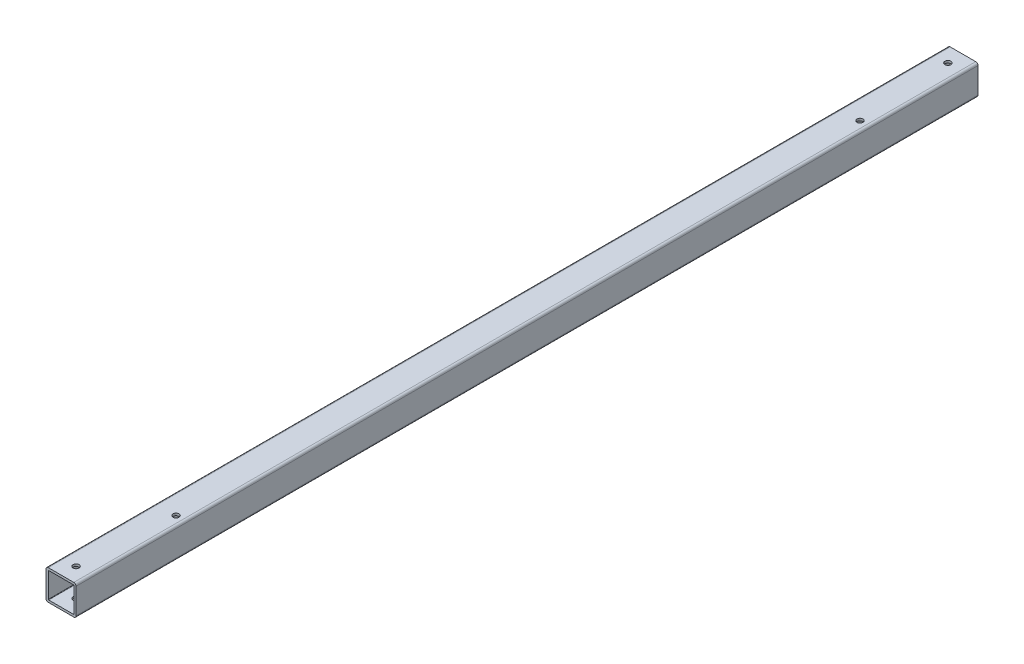
ISO-10303-21;
HEADER;
FILE_DESCRIPTION(('STEP AP214'),'2;1');
FILE_NAME('part.step','',(''),(''),'','','');
FILE_SCHEMA(('AUTOMOTIVE_DESIGN { 1 0 10303 214 1 1 1 1 }'));
ENDSEC;
DATA;
#1=APPLICATION_CONTEXT('core data for automotive mechanical design processes');
#2=APPLICATION_PROTOCOL_DEFINITION('international standard','automotive_design',2000,#1);
#3=PRODUCT_CONTEXT('',#1,'mechanical');
#4=PRODUCT('Part','Part','',(#3));
#5=PRODUCT_RELATED_PRODUCT_CATEGORY('part','',(#4));
#6=PRODUCT_DEFINITION_FORMATION('','',#4);
#7=PRODUCT_DEFINITION_CONTEXT('part definition',#1,'design');
#8=PRODUCT_DEFINITION('design','',#6,#7);
#9=PRODUCT_DEFINITION_SHAPE('','',#8);
#10=(LENGTH_UNIT() NAMED_UNIT(*) SI_UNIT(.MILLI.,.METRE.));
#11=(NAMED_UNIT(*) PLANE_ANGLE_UNIT() SI_UNIT($,.RADIAN.));
#12=(NAMED_UNIT(*) SI_UNIT($,.STERADIAN.) SOLID_ANGLE_UNIT());
#13=UNCERTAINTY_MEASURE_WITH_UNIT(LENGTH_MEASURE(1.E-05),#10,'distance_accuracy_value','');
#14=(GEOMETRIC_REPRESENTATION_CONTEXT(3) GLOBAL_UNCERTAINTY_ASSIGNED_CONTEXT((#13)) GLOBAL_UNIT_ASSIGNED_CONTEXT((#10,
#11,#12)) REPRESENTATION_CONTEXT('',''));
#15=CARTESIAN_POINT('',(0.,0.,0.));
#16=DIRECTION('',(0.,0.,1.));
#17=DIRECTION('',(1.,0.,0.));
#18=AXIS2_PLACEMENT_3D('',#15,#16,#17);
#19=CARTESIAN_POINT('',(0.,0.,1200.));
#20=DIRECTION('',(0.,0.,1.));
#21=DIRECTION('',(1.,0.,0.));
#22=AXIS2_PLACEMENT_3D('',#19,#20,#21);
#23=PLANE('',#22);
#24=DIRECTION('',(1.,0.,0.));
#25=VECTOR('',#24,1.);
#26=CARTESIAN_POINT('',(-20.,-20.,1200.));
#27=LINE('',#26,#25);
#28=CARTESIAN_POINT('',(-17.,-20.,1200.));
#29=VERTEX_POINT('',#28);
#30=CARTESIAN_POINT('',(17.,-20.,1200.));
#31=VERTEX_POINT('',#30);
#32=EDGE_CURVE('E199',#29,#31,#27,.T.);
#33=ORIENTED_EDGE('',*,*,#32,.T.);
#34=CARTESIAN_POINT('',(17.,-17.,1200.));
#35=DIRECTION('',(0.,0.,1.));
#36=DIRECTION('',(1.,0.,0.));
#37=AXIS2_PLACEMENT_3D('',#34,#35,#36);
#38=CIRCLE('',#37,3.);
#39=CARTESIAN_POINT('',(20.,-17.,1200.));
#40=VERTEX_POINT('',#39);
#41=EDGE_CURVE('E258',#31,#40,#38,.T.);
#42=ORIENTED_EDGE('',*,*,#41,.T.);
#43=DIRECTION('',(0.,1.,0.));
#44=VECTOR('',#43,1.);
#45=CARTESIAN_POINT('',(20.,20.,1200.));
#46=LINE('',#45,#44);
#47=CARTESIAN_POINT('',(20.,17.,1200.));
#48=VERTEX_POINT('',#47);
#49=EDGE_CURVE('E323',#40,#48,#46,.T.);
#50=ORIENTED_EDGE('',*,*,#49,.T.);
#51=CARTESIAN_POINT('',(17.,17.,1200.));
#52=DIRECTION('',(0.,0.,1.));
#53=DIRECTION('',(1.,0.,0.));
#54=AXIS2_PLACEMENT_3D('',#51,#52,#53);
#55=CIRCLE('',#54,3.);
#56=CARTESIAN_POINT('',(17.,20.,1200.));
#57=VERTEX_POINT('',#56);
#58=EDGE_CURVE('E254',#48,#57,#55,.T.);
#59=ORIENTED_EDGE('',*,*,#58,.T.);
#60=DIRECTION('',(-1.,0.,0.));
#61=VECTOR('',#60,1.);
#62=CARTESIAN_POINT('',(-20.,20.,1200.));
#63=LINE('',#62,#61);
#64=CARTESIAN_POINT('',(-17.,20.,1200.));
#65=VERTEX_POINT('',#64);
#66=EDGE_CURVE('E326',#57,#65,#63,.T.);
#67=ORIENTED_EDGE('',*,*,#66,.T.);
#68=CARTESIAN_POINT('',(-17.,17.,1200.));
#69=DIRECTION('',(0.,0.,1.));
#70=DIRECTION('',(1.,0.,0.));
#71=AXIS2_PLACEMENT_3D('',#68,#69,#70);
#72=CIRCLE('',#71,3.);
#73=CARTESIAN_POINT('',(-20.,17.,1200.));
#74=VERTEX_POINT('',#73);
#75=EDGE_CURVE('E80',#65,#74,#72,.T.);
#76=ORIENTED_EDGE('',*,*,#75,.T.);
#77=DIRECTION('',(0.,-1.,0.));
#78=VECTOR('',#77,1.);
#79=CARTESIAN_POINT('',(-20.,20.,1200.));
#80=LINE('',#79,#78);
#81=CARTESIAN_POINT('',(-20.,-17.,1200.));
#82=VERTEX_POINT('',#81);
#83=EDGE_CURVE('E204',#74,#82,#80,.T.);
#84=ORIENTED_EDGE('',*,*,#83,.T.);
#85=CARTESIAN_POINT('',(-17.,-17.,1200.));
#86=DIRECTION('',(0.,0.,1.));
#87=DIRECTION('',(1.,0.,0.));
#88=AXIS2_PLACEMENT_3D('',#85,#86,#87);
#89=CIRCLE('',#88,3.);
#90=EDGE_CURVE('E256',#82,#29,#89,.T.);
#91=ORIENTED_EDGE('',*,*,#90,.T.);
#92=EDGE_LOOP('',(#33,#42,#50,#59,#67,#76,#84,#91));
#93=FACE_BOUND('',#92,.T.);
#94=DIRECTION('',(-1.,0.,0.));
#95=VECTOR('',#94,1.);
#96=CARTESIAN_POINT('',(-20.,17.,1200.));
#97=LINE('',#96,#95);
#98=CARTESIAN_POINT('',(16.5,17.,1200.));
#99=VERTEX_POINT('',#98);
#100=CARTESIAN_POINT('',(-16.5,17.,1200.));
#101=VERTEX_POINT('',#100);
#102=EDGE_CURVE('E310',#99,#101,#97,.T.);
#103=ORIENTED_EDGE('',*,*,#102,.F.);
#104=CARTESIAN_POINT('',(16.5,16.5,1200.));
#105=DIRECTION('',(0.,0.,1.));
#106=DIRECTION('',(1.,0.,0.));
#107=AXIS2_PLACEMENT_3D('',#104,#105,#106);
#108=CIRCLE('',#107,0.5);
#109=CARTESIAN_POINT('',(17.,16.5,1200.));
#110=VERTEX_POINT('',#109);
#111=EDGE_CURVE('E229',#99,#110,#108,.F.);
#112=ORIENTED_EDGE('',*,*,#111,.T.);
#113=DIRECTION('',(0.,1.,0.));
#114=VECTOR('',#113,1.);
#115=CARTESIAN_POINT('',(17.,20.,1200.));
#116=LINE('',#115,#114);
#117=CARTESIAN_POINT('',(17.,-16.5,1200.));
#118=VERTEX_POINT('',#117);
#119=EDGE_CURVE('E307',#118,#110,#116,.T.);
#120=ORIENTED_EDGE('',*,*,#119,.F.);
#121=CARTESIAN_POINT('',(16.5,-16.5,1200.));
#122=DIRECTION('',(0.,0.,1.));
#123=DIRECTION('',(1.,0.,0.));
#124=AXIS2_PLACEMENT_3D('',#121,#122,#123);
#125=CIRCLE('',#124,0.5);
#126=CARTESIAN_POINT('',(16.5,-17.,1200.));
#127=VERTEX_POINT('',#126);
#128=EDGE_CURVE('E233',#118,#127,#125,.F.);
#129=ORIENTED_EDGE('',*,*,#128,.T.);
#130=DIRECTION('',(1.,0.,0.));
#131=VECTOR('',#130,1.);
#132=CARTESIAN_POINT('',(-20.,-17.,1200.));
#133=LINE('',#132,#131);
#134=CARTESIAN_POINT('',(-16.5,-17.,1200.));
#135=VERTEX_POINT('',#134);
#136=EDGE_CURVE('E315',#135,#127,#133,.T.);
#137=ORIENTED_EDGE('',*,*,#136,.F.);
#138=CARTESIAN_POINT('',(-16.5,-16.5,1200.));
#139=DIRECTION('',(0.,0.,1.));
#140=DIRECTION('',(1.,0.,0.));
#141=AXIS2_PLACEMENT_3D('',#138,#139,#140);
#142=CIRCLE('',#141,0.5);
#143=CARTESIAN_POINT('',(-17.,-16.5,1200.));
#144=VERTEX_POINT('',#143);
#145=EDGE_CURVE('E185',#135,#144,#142,.F.);
#146=ORIENTED_EDGE('',*,*,#145,.T.);
#147=DIRECTION('',(0.,-1.,0.));
#148=VECTOR('',#147,1.);
#149=CARTESIAN_POINT('',(-17.,20.,1200.));
#150=LINE('',#149,#148);
#151=CARTESIAN_POINT('',(-17.,16.5,1200.));
#152=VERTEX_POINT('',#151);
#153=EDGE_CURVE('E313',#152,#144,#150,.T.);
#154=ORIENTED_EDGE('',*,*,#153,.F.);
#155=CARTESIAN_POINT('',(-16.5,16.5,1200.));
#156=DIRECTION('',(0.,0.,1.));
#157=DIRECTION('',(1.,0.,0.));
#158=AXIS2_PLACEMENT_3D('',#155,#156,#157);
#159=CIRCLE('',#158,0.5);
#160=EDGE_CURVE('E184',#152,#101,#159,.F.);
#161=ORIENTED_EDGE('',*,*,#160,.T.);
#162=EDGE_LOOP('',(#103,#112,#120,#129,#137,#146,#154,#161));
#163=FACE_BOUND('',#162,.T.);
#164=ADVANCED_FACE('F56',(#93,#163),#23,.T.);
#165=CARTESIAN_POINT('',(0.,0.,0.));
#166=DIRECTION('',(0.,0.,1.));
#167=DIRECTION('',(1.,0.,0.));
#168=AXIS2_PLACEMENT_3D('',#165,#166,#167);
#169=PLANE('',#168);
#170=DIRECTION('',(0.,1.,0.));
#171=VECTOR('',#170,1.);
#172=CARTESIAN_POINT('',(20.,20.,0.));
#173=LINE('',#172,#171);
#174=CARTESIAN_POINT('',(20.,-17.,0.));
#175=VERTEX_POINT('',#174);
#176=CARTESIAN_POINT('',(20.,17.,0.));
#177=VERTEX_POINT('',#176);
#178=EDGE_CURVE('E318',#175,#177,#173,.T.);
#179=ORIENTED_EDGE('',*,*,#178,.F.);
#180=CARTESIAN_POINT('',(17.,-17.,0.));
#181=DIRECTION('',(0.,0.,1.));
#182=DIRECTION('',(1.,0.,0.));
#183=AXIS2_PLACEMENT_3D('',#180,#181,#182);
#184=CIRCLE('',#183,3.);
#185=CARTESIAN_POINT('',(17.,-20.,0.));
#186=VERTEX_POINT('',#185);
#187=EDGE_CURVE('E246',#175,#186,#184,.F.);
#188=ORIENTED_EDGE('',*,*,#187,.T.);
#189=DIRECTION('',(1.,0.,0.));
#190=VECTOR('',#189,1.);
#191=CARTESIAN_POINT('',(-20.,-20.,0.));
#192=LINE('',#191,#190);
#193=CARTESIAN_POINT('',(-17.,-20.,0.));
#194=VERTEX_POINT('',#193);
#195=EDGE_CURVE('E207',#194,#186,#192,.T.);
#196=ORIENTED_EDGE('',*,*,#195,.F.);
#197=CARTESIAN_POINT('',(-17.,-17.,0.));
#198=DIRECTION('',(0.,0.,1.));
#199=DIRECTION('',(1.,0.,0.));
#200=AXIS2_PLACEMENT_3D('',#197,#198,#199);
#201=CIRCLE('',#200,3.);
#202=CARTESIAN_POINT('',(-20.,-17.,0.));
#203=VERTEX_POINT('',#202);
#204=EDGE_CURVE('E244',#194,#203,#201,.F.);
#205=ORIENTED_EDGE('',*,*,#204,.T.);
#206=DIRECTION('',(0.,-1.,0.));
#207=VECTOR('',#206,1.);
#208=CARTESIAN_POINT('',(-20.,20.,0.));
#209=LINE('',#208,#207);
#210=CARTESIAN_POINT('',(-20.,17.,0.));
#211=VERTEX_POINT('',#210);
#212=EDGE_CURVE('E333',#211,#203,#209,.T.);
#213=ORIENTED_EDGE('',*,*,#212,.F.);
#214=CARTESIAN_POINT('',(-17.,17.,0.));
#215=DIRECTION('',(0.,0.,1.));
#216=DIRECTION('',(1.,0.,0.));
#217=AXIS2_PLACEMENT_3D('',#214,#215,#216);
#218=CIRCLE('',#217,3.);
#219=CARTESIAN_POINT('',(-17.,20.,0.));
#220=VERTEX_POINT('',#219);
#221=EDGE_CURVE('E240',#211,#220,#218,.F.);
#222=ORIENTED_EDGE('',*,*,#221,.T.);
#223=DIRECTION('',(-1.,0.,0.));
#224=VECTOR('',#223,1.);
#225=CARTESIAN_POINT('',(-20.,20.,0.));
#226=LINE('',#225,#224);
#227=CARTESIAN_POINT('',(17.,20.,0.));
#228=VERTEX_POINT('',#227);
#229=EDGE_CURVE('E331',#228,#220,#226,.T.);
#230=ORIENTED_EDGE('',*,*,#229,.F.);
#231=CARTESIAN_POINT('',(17.,17.,0.));
#232=DIRECTION('',(0.,0.,1.));
#233=DIRECTION('',(1.,0.,0.));
#234=AXIS2_PLACEMENT_3D('',#231,#232,#233);
#235=CIRCLE('',#234,3.);
#236=EDGE_CURVE('E242',#228,#177,#235,.F.);
#237=ORIENTED_EDGE('',*,*,#236,.T.);
#238=EDGE_LOOP('',(#179,#188,#196,#205,#213,#222,#230,#237));
#239=FACE_BOUND('',#238,.T.);
#240=DIRECTION('',(1.,0.,0.));
#241=VECTOR('',#240,1.);
#242=CARTESIAN_POINT('',(-20.,-17.,0.));
#243=LINE('',#242,#241);
#244=CARTESIAN_POINT('',(-16.5,-17.,0.));
#245=VERTEX_POINT('',#244);
#246=CARTESIAN_POINT('',(16.5,-17.,0.));
#247=VERTEX_POINT('',#246);
#248=EDGE_CURVE('E195',#245,#247,#243,.T.);
#249=ORIENTED_EDGE('',*,*,#248,.T.);
#250=CARTESIAN_POINT('',(16.5,-16.5,0.));
#251=DIRECTION('',(0.,0.,1.));
#252=DIRECTION('',(1.,0.,0.));
#253=AXIS2_PLACEMENT_3D('',#250,#251,#252);
#254=CIRCLE('',#253,0.5);
#255=CARTESIAN_POINT('',(17.,-16.5,0.));
#256=VERTEX_POINT('',#255);
#257=EDGE_CURVE('E231',#247,#256,#254,.T.);
#258=ORIENTED_EDGE('',*,*,#257,.T.);
#259=DIRECTION('',(0.,1.,0.));
#260=VECTOR('',#259,1.);
#261=CARTESIAN_POINT('',(17.,20.,0.));
#262=LINE('',#261,#260);
#263=CARTESIAN_POINT('',(17.,16.5,0.));
#264=VERTEX_POINT('',#263);
#265=EDGE_CURVE('E306',#256,#264,#262,.T.);
#266=ORIENTED_EDGE('',*,*,#265,.T.);
#267=CARTESIAN_POINT('',(16.5,16.5,0.));
#268=DIRECTION('',(0.,0.,1.));
#269=DIRECTION('',(1.,0.,0.));
#270=AXIS2_PLACEMENT_3D('',#267,#268,#269);
#271=CIRCLE('',#270,0.5);
#272=CARTESIAN_POINT('',(16.5,17.,0.));
#273=VERTEX_POINT('',#272);
#274=EDGE_CURVE('E227',#264,#273,#271,.T.);
#275=ORIENTED_EDGE('',*,*,#274,.T.);
#276=DIRECTION('',(-1.,0.,0.));
#277=VECTOR('',#276,1.);
#278=CARTESIAN_POINT('',(-20.,17.,0.));
#279=LINE('',#278,#277);
#280=CARTESIAN_POINT('',(-16.5,17.,0.));
#281=VERTEX_POINT('',#280);
#282=EDGE_CURVE('E179',#273,#281,#279,.T.);
#283=ORIENTED_EDGE('',*,*,#282,.T.);
#284=CARTESIAN_POINT('',(-16.5,16.5,0.));
#285=DIRECTION('',(0.,0.,1.));
#286=DIRECTION('',(1.,0.,0.));
#287=AXIS2_PLACEMENT_3D('',#284,#285,#286);
#288=CIRCLE('',#287,0.5);
#289=CARTESIAN_POINT('',(-17.,16.5,0.));
#290=VERTEX_POINT('',#289);
#291=EDGE_CURVE('E173',#281,#290,#288,.T.);
#292=ORIENTED_EDGE('',*,*,#291,.T.);
#293=DIRECTION('',(0.,-1.,0.));
#294=VECTOR('',#293,1.);
#295=CARTESIAN_POINT('',(-17.,20.,0.));
#296=LINE('',#295,#294);
#297=CARTESIAN_POINT('',(-17.,-16.5,0.));
#298=VERTEX_POINT('',#297);
#299=EDGE_CURVE('E177',#290,#298,#296,.T.);
#300=ORIENTED_EDGE('',*,*,#299,.T.);
#301=CARTESIAN_POINT('',(-16.5,-16.5,0.));
#302=DIRECTION('',(0.,0.,1.));
#303=DIRECTION('',(1.,0.,0.));
#304=AXIS2_PLACEMENT_3D('',#301,#302,#303);
#305=CIRCLE('',#304,0.5);
#306=EDGE_CURVE('E223',#298,#245,#305,.T.);
#307=ORIENTED_EDGE('',*,*,#306,.T.);
#308=EDGE_LOOP('',(#249,#258,#266,#275,#283,#292,#300,#307));
#309=FACE_BOUND('',#308,.T.);
#310=ADVANCED_FACE('F176',(#239,#309),#169,.F.);
#311=CARTESIAN_POINT('',(20.,20.,1200.));
#312=DIRECTION('',(-1.,0.,0.));
#313=DIRECTION('',(0.,-1.,0.));
#314=AXIS2_PLACEMENT_3D('',#311,#312,#313);
#315=PLANE('',#314);
#316=ORIENTED_EDGE('',*,*,#49,.F.);
#317=DIRECTION('',(0.,0.,-1.));
#318=VECTOR('',#317,1.);
#319=CARTESIAN_POINT('',(20.,-17.,1200.));
#320=LINE('',#319,#318);
#321=EDGE_CURVE('E237',#40,#175,#320,.T.);
#322=ORIENTED_EDGE('',*,*,#321,.T.);
#323=ORIENTED_EDGE('',*,*,#178,.T.);
#324=DIRECTION('',(0.,0.,-1.));
#325=VECTOR('',#324,1.);
#326=CARTESIAN_POINT('',(20.,17.,1200.));
#327=LINE('',#326,#325);
#328=EDGE_CURVE('E235',#177,#48,#327,.F.);
#329=ORIENTED_EDGE('',*,*,#328,.T.);
#330=EDGE_LOOP('',(#316,#322,#323,#329));
#331=FACE_BOUND('',#330,.T.);
#332=ADVANCED_FACE('F351',(#331),#315,.F.);
#333=CARTESIAN_POINT('',(-20.,20.,1200.));
#334=DIRECTION('',(0.,-1.,0.));
#335=DIRECTION('',(0.,0.,-1.));
#336=AXIS2_PLACEMENT_3D('',#333,#334,#335);
#337=PLANE('',#336);
#338=CARTESIAN_POINT('',(8.,20.,1055.));
#339=DIRECTION('',(0.,1.,0.));
#340=DIRECTION('',(0.,0.,1.));
#341=AXIS2_PLACEMENT_3D('',#338,#339,#340);
#342=CIRCLE('',#341,3.99999999999999);
#343=CARTESIAN_POINT('',(8.,20.,1059.));
#344=VERTEX_POINT('',#343);
#345=EDGE_CURVE('E471',#344,#344,#342,.T.);
#346=ORIENTED_EDGE('',*,*,#345,.F.);
#347=EDGE_LOOP('',(#346));
#348=FACE_BOUND('',#347,.T.);
#349=CARTESIAN_POINT('',(8.,20.,145.));
#350=DIRECTION('',(0.,1.,0.));
#351=DIRECTION('',(0.,0.,1.));
#352=AXIS2_PLACEMENT_3D('',#349,#350,#351);
#353=CIRCLE('',#352,3.99999999999999);
#354=CARTESIAN_POINT('',(8.,20.,149.));
#355=VERTEX_POINT('',#354);
#356=EDGE_CURVE('E279',#355,#355,#353,.T.);
#357=ORIENTED_EDGE('',*,*,#356,.F.);
#358=EDGE_LOOP('',(#357));
#359=FACE_BOUND('',#358,.T.);
#360=CARTESIAN_POINT('',(0.,20.,20.));
#361=DIRECTION('',(0.,1.,0.));
#362=DIRECTION('',(0.,0.,1.));
#363=AXIS2_PLACEMENT_3D('',#360,#361,#362);
#364=CIRCLE('',#363,4.);
#365=CARTESIAN_POINT('',(0.,20.,24.));
#366=VERTEX_POINT('',#365);
#367=EDGE_CURVE('E276',#366,#366,#364,.T.);
#368=ORIENTED_EDGE('',*,*,#367,.F.);
#369=EDGE_LOOP('',(#368));
#370=FACE_BOUND('',#369,.T.);
#371=CARTESIAN_POINT('',(1.44508322299388E-13,20.,1180.));
#372=DIRECTION('',(0.,1.,0.));
#373=DIRECTION('',(0.,0.,1.));
#374=AXIS2_PLACEMENT_3D('',#371,#372,#373);
#375=CIRCLE('',#374,4.);
#376=CARTESIAN_POINT('',(1.44508322299388E-13,20.,1184.));
#377=VERTEX_POINT('',#376);
#378=EDGE_CURVE('E294',#377,#377,#375,.T.);
#379=ORIENTED_EDGE('',*,*,#378,.F.);
#380=EDGE_LOOP('',(#379));
#381=FACE_BOUND('',#380,.T.);
#382=ORIENTED_EDGE('',*,*,#66,.F.);
#383=DIRECTION('',(0.,0.,-1.));
#384=VECTOR('',#383,1.);
#385=CARTESIAN_POINT('',(17.,20.,1200.));
#386=LINE('',#385,#384);
#387=EDGE_CURVE('E12',#57,#228,#386,.T.);
#388=ORIENTED_EDGE('',*,*,#387,.T.);
#389=ORIENTED_EDGE('',*,*,#229,.T.);
#390=DIRECTION('',(0.,0.,-1.));
#391=VECTOR('',#390,1.);
#392=CARTESIAN_POINT('',(-17.,20.,1200.));
#393=LINE('',#392,#391);
#394=EDGE_CURVE('E65',#220,#65,#393,.F.);
#395=ORIENTED_EDGE('',*,*,#394,.T.);
#396=EDGE_LOOP('',(#382,#388,#389,#395));
#397=FACE_BOUND('',#396,.T.);
#398=ADVANCED_FACE('F359',(#348,#359,#370,#381,#397),#337,.F.);
#399=CARTESIAN_POINT('',(-20.,20.,1200.));
#400=DIRECTION('',(1.,0.,0.));
#401=DIRECTION('',(0.,1.,0.));
#402=AXIS2_PLACEMENT_3D('',#399,#400,#401);
#403=PLANE('',#402);
#404=ORIENTED_EDGE('',*,*,#212,.T.);
#405=DIRECTION('',(0.,0.,-1.));
#406=VECTOR('',#405,1.);
#407=CARTESIAN_POINT('',(-20.,-17.,1200.));
#408=LINE('',#407,#406);
#409=EDGE_CURVE('E73',#203,#82,#408,.F.);
#410=ORIENTED_EDGE('',*,*,#409,.T.);
#411=ORIENTED_EDGE('',*,*,#83,.F.);
#412=DIRECTION('',(0.,0.,-1.));
#413=VECTOR('',#412,1.);
#414=CARTESIAN_POINT('',(-20.,17.,1200.));
#415=LINE('',#414,#413);
#416=EDGE_CURVE('E260',#74,#211,#415,.T.);
#417=ORIENTED_EDGE('',*,*,#416,.T.);
#418=EDGE_LOOP('',(#404,#410,#411,#417));
#419=FACE_BOUND('',#418,.T.);
#420=ADVANCED_FACE('F364',(#419),#403,.F.);
#421=CARTESIAN_POINT('',(-20.,-20.,1200.));
#422=DIRECTION('',(0.,1.,0.));
#423=DIRECTION('',(0.,0.,1.));
#424=AXIS2_PLACEMENT_3D('',#421,#422,#423);
#425=PLANE('',#424);
#426=CARTESIAN_POINT('',(8.,-20.,1055.));
#427=DIRECTION('',(0.,1.,0.));
#428=DIRECTION('',(0.,0.,1.));
#429=AXIS2_PLACEMENT_3D('',#426,#427,#428);
#430=CIRCLE('',#429,3.99999999999999);
#431=CARTESIAN_POINT('',(8.,-20.,1059.));
#432=VERTEX_POINT('',#431);
#433=EDGE_CURVE('E472',#432,#432,#430,.T.);
#434=ORIENTED_EDGE('',*,*,#433,.T.);
#435=EDGE_LOOP('',(#434));
#436=FACE_BOUND('',#435,.T.);
#437=CARTESIAN_POINT('',(8.,-20.,145.));
#438=DIRECTION('',(0.,1.,0.));
#439=DIRECTION('',(0.,0.,1.));
#440=AXIS2_PLACEMENT_3D('',#437,#438,#439);
#441=CIRCLE('',#440,3.99999999999999);
#442=CARTESIAN_POINT('',(8.,-20.,149.));
#443=VERTEX_POINT('',#442);
#444=EDGE_CURVE('E272',#443,#443,#441,.T.);
#445=ORIENTED_EDGE('',*,*,#444,.T.);
#446=EDGE_LOOP('',(#445));
#447=FACE_BOUND('',#446,.T.);
#448=CARTESIAN_POINT('',(0.,-20.,20.));
#449=DIRECTION('',(0.,1.,0.));
#450=DIRECTION('',(0.,0.,1.));
#451=AXIS2_PLACEMENT_3D('',#448,#449,#450);
#452=CIRCLE('',#451,3.99999999999999);
#453=CARTESIAN_POINT('',(0.,-20.,24.));
#454=VERTEX_POINT('',#453);
#455=EDGE_CURVE('E268',#454,#454,#452,.T.);
#456=ORIENTED_EDGE('',*,*,#455,.T.);
#457=EDGE_LOOP('',(#456));
#458=FACE_BOUND('',#457,.T.);
#459=CARTESIAN_POINT('',(1.44508322299388E-13,-20.,1180.));
#460=DIRECTION('',(0.,1.,0.));
#461=DIRECTION('',(0.,0.,1.));
#462=AXIS2_PLACEMENT_3D('',#459,#460,#461);
#463=CIRCLE('',#462,3.99999999999999);
#464=CARTESIAN_POINT('',(1.44508322299388E-13,-20.,1184.));
#465=VERTEX_POINT('',#464);
#466=EDGE_CURVE('E297',#465,#465,#463,.T.);
#467=ORIENTED_EDGE('',*,*,#466,.T.);
#468=EDGE_LOOP('',(#467));
#469=FACE_BOUND('',#468,.T.);
#470=ORIENTED_EDGE('',*,*,#195,.T.);
#471=DIRECTION('',(0.,0.,-1.));
#472=VECTOR('',#471,1.);
#473=CARTESIAN_POINT('',(17.,-20.,1200.));
#474=LINE('',#473,#472);
#475=EDGE_CURVE('E251',#186,#31,#474,.F.);
#476=ORIENTED_EDGE('',*,*,#475,.T.);
#477=ORIENTED_EDGE('',*,*,#32,.F.);
#478=DIRECTION('',(0.,0.,-1.));
#479=VECTOR('',#478,1.);
#480=CARTESIAN_POINT('',(-17.,-20.,1200.));
#481=LINE('',#480,#479);
#482=EDGE_CURVE('E248',#29,#194,#481,.T.);
#483=ORIENTED_EDGE('',*,*,#482,.T.);
#484=EDGE_LOOP('',(#470,#476,#477,#483));
#485=FACE_BOUND('',#484,.T.);
#486=ADVANCED_FACE('F339',(#436,#447,#458,#469,#485),#425,.F.);
#487=CARTESIAN_POINT('',(17.,20.,1200.));
#488=DIRECTION('',(-1.,0.,0.));
#489=DIRECTION('',(0.,-1.,0.));
#490=AXIS2_PLACEMENT_3D('',#487,#488,#489);
#491=PLANE('',#490);
#492=ORIENTED_EDGE('',*,*,#119,.T.);
#493=DIRECTION('',(0.,0.,-1.));
#494=VECTOR('',#493,1.);
#495=CARTESIAN_POINT('',(17.,16.5,0.));
#496=LINE('',#495,#494);
#497=EDGE_CURVE('E220',#110,#264,#496,.T.);
#498=ORIENTED_EDGE('',*,*,#497,.T.);
#499=ORIENTED_EDGE('',*,*,#265,.F.);
#500=DIRECTION('',(0.,0.,-1.));
#501=VECTOR('',#500,1.);
#502=CARTESIAN_POINT('',(17.,-16.5,1200.));
#503=LINE('',#502,#501);
#504=EDGE_CURVE('E218',#256,#118,#503,.F.);
#505=ORIENTED_EDGE('',*,*,#504,.T.);
#506=EDGE_LOOP('',(#492,#498,#499,#505));
#507=FACE_BOUND('',#506,.T.);
#508=ADVANCED_FACE('F383',(#507),#491,.T.);
#509=CARTESIAN_POINT('',(-20.,17.,1200.));
#510=DIRECTION('',(0.,-1.,0.));
#511=DIRECTION('',(0.,0.,-1.));
#512=AXIS2_PLACEMENT_3D('',#509,#510,#511);
#513=PLANE('',#512);
#514=CARTESIAN_POINT('',(8.,17.,1055.));
#515=DIRECTION('',(0.,-1.,0.));
#516=DIRECTION('',(0.,0.,-1.));
#517=AXIS2_PLACEMENT_3D('',#514,#515,#516);
#518=CIRCLE('',#517,3.99999999999999);
#519=CARTESIAN_POINT('',(8.,17.,1051.));
#520=VERTEX_POINT('',#519);
#521=EDGE_CURVE('E60',#520,#520,#518,.T.);
#522=ORIENTED_EDGE('',*,*,#521,.F.);
#523=EDGE_LOOP('',(#522));
#524=FACE_BOUND('',#523,.T.);
#525=CARTESIAN_POINT('',(8.,17.,145.));
#526=DIRECTION('',(0.,-1.,0.));
#527=DIRECTION('',(0.,0.,-1.));
#528=AXIS2_PLACEMENT_3D('',#525,#526,#527);
#529=CIRCLE('',#528,3.99999999999999);
#530=CARTESIAN_POINT('',(8.,17.,141.));
#531=VERTEX_POINT('',#530);
#532=EDGE_CURVE('E269',#531,#531,#529,.T.);
#533=ORIENTED_EDGE('',*,*,#532,.F.);
#534=EDGE_LOOP('',(#533));
#535=FACE_BOUND('',#534,.T.);
#536=CARTESIAN_POINT('',(0.,17.,20.));
#537=DIRECTION('',(0.,-1.,0.));
#538=DIRECTION('',(0.,0.,-1.));
#539=AXIS2_PLACEMENT_3D('',#536,#537,#538);
#540=CIRCLE('',#539,4.);
#541=CARTESIAN_POINT('',(0.,17.,16.));
#542=VERTEX_POINT('',#541);
#543=EDGE_CURVE('E265',#542,#542,#540,.T.);
#544=ORIENTED_EDGE('',*,*,#543,.F.);
#545=EDGE_LOOP('',(#544));
#546=FACE_BOUND('',#545,.T.);
#547=CARTESIAN_POINT('',(1.44508322299388E-13,17.,1180.));
#548=DIRECTION('',(0.,-1.,0.));
#549=DIRECTION('',(0.,0.,-1.));
#550=AXIS2_PLACEMENT_3D('',#547,#548,#549);
#551=CIRCLE('',#550,4.);
#552=CARTESIAN_POINT('',(1.44508322299388E-13,17.,1176.));
#553=VERTEX_POINT('',#552);
#554=EDGE_CURVE('E300',#553,#553,#551,.T.);
#555=ORIENTED_EDGE('',*,*,#554,.F.);
#556=EDGE_LOOP('',(#555));
#557=FACE_BOUND('',#556,.T.);
#558=ORIENTED_EDGE('',*,*,#102,.T.);
#559=DIRECTION('',(0.,0.,-1.));
#560=VECTOR('',#559,1.);
#561=CARTESIAN_POINT('',(-16.5,17.,0.));
#562=LINE('',#561,#560);
#563=EDGE_CURVE('E216',#101,#281,#562,.T.);
#564=ORIENTED_EDGE('',*,*,#563,.T.);
#565=ORIENTED_EDGE('',*,*,#282,.F.);
#566=DIRECTION('',(0.,0.,-1.));
#567=VECTOR('',#566,1.);
#568=CARTESIAN_POINT('',(16.5,17.,1200.));
#569=LINE('',#568,#567);
#570=EDGE_CURVE('E214',#273,#99,#569,.F.);
#571=ORIENTED_EDGE('',*,*,#570,.T.);
#572=EDGE_LOOP('',(#558,#564,#565,#571));
#573=FACE_BOUND('',#572,.T.);
#574=ADVANCED_FACE('F423',(#524,#535,#546,#557,#573),#513,.T.);
#575=CARTESIAN_POINT('',(-17.,20.,1200.));
#576=DIRECTION('',(1.,0.,0.));
#577=DIRECTION('',(0.,1.,0.));
#578=AXIS2_PLACEMENT_3D('',#575,#576,#577);
#579=PLANE('',#578);
#580=ORIENTED_EDGE('',*,*,#153,.T.);
#581=DIRECTION('',(0.,0.,-1.));
#582=VECTOR('',#581,1.);
#583=CARTESIAN_POINT('',(-17.,-16.5,0.));
#584=LINE('',#583,#582);
#585=EDGE_CURVE('E194',#144,#298,#584,.T.);
#586=ORIENTED_EDGE('',*,*,#585,.T.);
#587=ORIENTED_EDGE('',*,*,#299,.F.);
#588=DIRECTION('',(0.,0.,-1.));
#589=VECTOR('',#588,1.);
#590=CARTESIAN_POINT('',(-17.,16.5,1200.));
#591=LINE('',#590,#589);
#592=EDGE_CURVE('E191',#290,#152,#591,.F.);
#593=ORIENTED_EDGE('',*,*,#592,.T.);
#594=EDGE_LOOP('',(#580,#586,#587,#593));
#595=FACE_BOUND('',#594,.T.);
#596=ADVANCED_FACE('F190',(#595),#579,.T.);
#597=CARTESIAN_POINT('',(-20.,-17.,1200.));
#598=DIRECTION('',(0.,1.,0.));
#599=DIRECTION('',(0.,0.,1.));
#600=AXIS2_PLACEMENT_3D('',#597,#598,#599);
#601=PLANE('',#600);
#602=CARTESIAN_POINT('',(8.,-17.,1055.));
#603=DIRECTION('',(0.,1.,0.));
#604=DIRECTION('',(0.,0.,1.));
#605=AXIS2_PLACEMENT_3D('',#602,#603,#604);
#606=CIRCLE('',#605,3.99999999999999);
#607=CARTESIAN_POINT('',(8.,-17.,1059.));
#608=VERTEX_POINT('',#607);
#609=EDGE_CURVE('E284',#608,#608,#606,.T.);
#610=ORIENTED_EDGE('',*,*,#609,.F.);
#611=EDGE_LOOP('',(#610));
#612=FACE_BOUND('',#611,.T.);
#613=CARTESIAN_POINT('',(8.,-17.,145.));
#614=DIRECTION('',(0.,1.,0.));
#615=DIRECTION('',(0.,0.,1.));
#616=AXIS2_PLACEMENT_3D('',#613,#614,#615);
#617=CIRCLE('',#616,3.99999999999999);
#618=CARTESIAN_POINT('',(8.,-17.,149.));
#619=VERTEX_POINT('',#618);
#620=EDGE_CURVE('E271',#619,#619,#617,.T.);
#621=ORIENTED_EDGE('',*,*,#620,.F.);
#622=EDGE_LOOP('',(#621));
#623=FACE_BOUND('',#622,.T.);
#624=CARTESIAN_POINT('',(0.,-17.,20.));
#625=DIRECTION('',(0.,1.,0.));
#626=DIRECTION('',(0.,0.,1.));
#627=AXIS2_PLACEMENT_3D('',#624,#625,#626);
#628=CIRCLE('',#627,4.);
#629=CARTESIAN_POINT('',(0.,-17.,24.));
#630=VERTEX_POINT('',#629);
#631=EDGE_CURVE('E267',#630,#630,#628,.T.);
#632=ORIENTED_EDGE('',*,*,#631,.F.);
#633=EDGE_LOOP('',(#632));
#634=FACE_BOUND('',#633,.T.);
#635=CARTESIAN_POINT('',(1.44508322299388E-13,-17.,1180.));
#636=DIRECTION('',(0.,1.,0.));
#637=DIRECTION('',(0.,0.,1.));
#638=AXIS2_PLACEMENT_3D('',#635,#636,#637);
#639=CIRCLE('',#638,4.);
#640=CARTESIAN_POINT('',(1.44508322299388E-13,-17.,1184.));
#641=VERTEX_POINT('',#640);
#642=EDGE_CURVE('E303',#641,#641,#639,.T.);
#643=ORIENTED_EDGE('',*,*,#642,.F.);
#644=EDGE_LOOP('',(#643));
#645=FACE_BOUND('',#644,.T.);
#646=ORIENTED_EDGE('',*,*,#248,.F.);
#647=DIRECTION('',(0.,0.,-1.));
#648=VECTOR('',#647,1.);
#649=CARTESIAN_POINT('',(-16.5,-17.,1200.));
#650=LINE('',#649,#648);
#651=EDGE_CURVE('E212',#245,#135,#650,.F.);
#652=ORIENTED_EDGE('',*,*,#651,.T.);
#653=ORIENTED_EDGE('',*,*,#136,.T.);
#654=DIRECTION('',(0.,0.,-1.));
#655=VECTOR('',#654,1.);
#656=CARTESIAN_POINT('',(16.5,-17.,0.));
#657=LINE('',#656,#655);
#658=EDGE_CURVE('E201',#127,#247,#657,.T.);
#659=ORIENTED_EDGE('',*,*,#658,.T.);
#660=EDGE_LOOP('',(#646,#652,#653,#659));
#661=FACE_BOUND('',#660,.T.);
#662=ADVANCED_FACE('F399',(#612,#623,#634,#645,#661),#601,.T.);
#663=CARTESIAN_POINT('',(-16.5,-16.5,1200.));
#664=DIRECTION('',(0.,0.,1.));
#665=DIRECTION('',(1.,0.,0.));
#666=AXIS2_PLACEMENT_3D('',#663,#664,#665);
#667=CYLINDRICAL_SURFACE('',#666,0.5);
#668=ORIENTED_EDGE('',*,*,#145,.F.);
#669=ORIENTED_EDGE('',*,*,#651,.F.);
#670=ORIENTED_EDGE('',*,*,#306,.F.);
#671=ORIENTED_EDGE('',*,*,#585,.F.);
#672=EDGE_LOOP('',(#668,#669,#670,#671));
#673=FACE_BOUND('',#672,.T.);
#674=ADVANCED_FACE('F396',(#673),#667,.F.);
#675=CARTESIAN_POINT('',(-16.5,16.5,1200.));
#676=DIRECTION('',(0.,0.,1.));
#677=DIRECTION('',(1.,0.,0.));
#678=AXIS2_PLACEMENT_3D('',#675,#676,#677);
#679=CYLINDRICAL_SURFACE('',#678,0.5);
#680=ORIENTED_EDGE('',*,*,#160,.F.);
#681=ORIENTED_EDGE('',*,*,#592,.F.);
#682=ORIENTED_EDGE('',*,*,#291,.F.);
#683=ORIENTED_EDGE('',*,*,#563,.F.);
#684=EDGE_LOOP('',(#680,#681,#682,#683));
#685=FACE_BOUND('',#684,.T.);
#686=ADVANCED_FACE('F198',(#685),#679,.F.);
#687=CARTESIAN_POINT('',(16.5,16.5,1200.));
#688=DIRECTION('',(0.,0.,1.));
#689=DIRECTION('',(1.,0.,0.));
#690=AXIS2_PLACEMENT_3D('',#687,#688,#689);
#691=CYLINDRICAL_SURFACE('',#690,0.5);
#692=ORIENTED_EDGE('',*,*,#111,.F.);
#693=ORIENTED_EDGE('',*,*,#570,.F.);
#694=ORIENTED_EDGE('',*,*,#274,.F.);
#695=ORIENTED_EDGE('',*,*,#497,.F.);
#696=EDGE_LOOP('',(#692,#693,#694,#695));
#697=FACE_BOUND('',#696,.T.);
#698=ADVANCED_FACE('F403',(#697),#691,.F.);
#699=CARTESIAN_POINT('',(16.5,-16.5,1200.));
#700=DIRECTION('',(0.,0.,1.));
#701=DIRECTION('',(1.,0.,0.));
#702=AXIS2_PLACEMENT_3D('',#699,#700,#701);
#703=CYLINDRICAL_SURFACE('',#702,0.5);
#704=ORIENTED_EDGE('',*,*,#128,.F.);
#705=ORIENTED_EDGE('',*,*,#504,.F.);
#706=ORIENTED_EDGE('',*,*,#257,.F.);
#707=ORIENTED_EDGE('',*,*,#658,.F.);
#708=EDGE_LOOP('',(#704,#705,#706,#707));
#709=FACE_BOUND('',#708,.T.);
#710=ADVANCED_FACE('F374',(#709),#703,.F.);
#711=CARTESIAN_POINT('',(17.,-17.,1200.));
#712=DIRECTION('',(0.,0.,-1.));
#713=DIRECTION('',(-1.,0.,0.));
#714=AXIS2_PLACEMENT_3D('',#711,#712,#713);
#715=CYLINDRICAL_SURFACE('',#714,3.);
#716=ORIENTED_EDGE('',*,*,#41,.F.);
#717=ORIENTED_EDGE('',*,*,#475,.F.);
#718=ORIENTED_EDGE('',*,*,#187,.F.);
#719=ORIENTED_EDGE('',*,*,#321,.F.);
#720=EDGE_LOOP('',(#716,#717,#718,#719));
#721=FACE_BOUND('',#720,.T.);
#722=ADVANCED_FACE('F345',(#721),#715,.T.);
#723=CARTESIAN_POINT('',(-17.,-17.,1200.));
#724=DIRECTION('',(0.,0.,-1.));
#725=DIRECTION('',(-1.,0.,0.));
#726=AXIS2_PLACEMENT_3D('',#723,#724,#725);
#727=CYLINDRICAL_SURFACE('',#726,3.);
#728=ORIENTED_EDGE('',*,*,#90,.F.);
#729=ORIENTED_EDGE('',*,*,#409,.F.);
#730=ORIENTED_EDGE('',*,*,#204,.F.);
#731=ORIENTED_EDGE('',*,*,#482,.F.);
#732=EDGE_LOOP('',(#728,#729,#730,#731));
#733=FACE_BOUND('',#732,.T.);
#734=ADVANCED_FACE('F367',(#733),#727,.T.);
#735=CARTESIAN_POINT('',(17.,17.,1200.));
#736=DIRECTION('',(0.,0.,-1.));
#737=DIRECTION('',(-1.,0.,0.));
#738=AXIS2_PLACEMENT_3D('',#735,#736,#737);
#739=CYLINDRICAL_SURFACE('',#738,3.);
#740=ORIENTED_EDGE('',*,*,#58,.F.);
#741=ORIENTED_EDGE('',*,*,#328,.F.);
#742=ORIENTED_EDGE('',*,*,#236,.F.);
#743=ORIENTED_EDGE('',*,*,#387,.F.);
#744=EDGE_LOOP('',(#740,#741,#742,#743));
#745=FACE_BOUND('',#744,.T.);
#746=ADVANCED_FACE('F355',(#745),#739,.T.);
#747=CARTESIAN_POINT('',(-17.,17.,1200.));
#748=DIRECTION('',(0.,0.,-1.));
#749=DIRECTION('',(-1.,0.,0.));
#750=AXIS2_PLACEMENT_3D('',#747,#748,#749);
#751=CYLINDRICAL_SURFACE('',#750,3.);
#752=ORIENTED_EDGE('',*,*,#75,.F.);
#753=ORIENTED_EDGE('',*,*,#394,.F.);
#754=ORIENTED_EDGE('',*,*,#221,.F.);
#755=ORIENTED_EDGE('',*,*,#416,.F.);
#756=EDGE_LOOP('',(#752,#753,#754,#755));
#757=FACE_BOUND('',#756,.T.);
#758=ADVANCED_FACE('F58',(#757),#751,.T.);
#759=CARTESIAN_POINT('',(1.44508322299388E-13,20.,1180.));
#760=DIRECTION('',(0.,1.,0.));
#761=DIRECTION('',(0.,0.,1.));
#762=AXIS2_PLACEMENT_3D('',#759,#760,#761);
#763=CYLINDRICAL_SURFACE('',#762,4.);
#764=ORIENTED_EDGE('',*,*,#642,.T.);
#765=EDGE_LOOP('',(#764));
#766=FACE_BOUND('',#765,.T.);
#767=ORIENTED_EDGE('',*,*,#466,.F.);
#768=EDGE_LOOP('',(#767));
#769=FACE_BOUND('',#768,.T.);
#770=ADVANCED_FACE('F447',(#766,#769),#763,.F.);
#771=ORIENTED_EDGE('',*,*,#554,.T.);
#772=EDGE_LOOP('',(#771));
#773=FACE_BOUND('',#772,.T.);
#774=ORIENTED_EDGE('',*,*,#378,.T.);
#775=EDGE_LOOP('',(#774));
#776=FACE_BOUND('',#775,.T.);
#777=ADVANCED_FACE('F443',(#773,#776),#763,.F.);
#778=CARTESIAN_POINT('',(0.,20.,20.));
#779=DIRECTION('',(0.,1.,0.));
#780=DIRECTION('',(0.,0.,1.));
#781=AXIS2_PLACEMENT_3D('',#778,#779,#780);
#782=CYLINDRICAL_SURFACE('',#781,4.);
#783=ORIENTED_EDGE('',*,*,#543,.T.);
#784=EDGE_LOOP('',(#783));
#785=FACE_BOUND('',#784,.T.);
#786=ORIENTED_EDGE('',*,*,#367,.T.);
#787=EDGE_LOOP('',(#786));
#788=FACE_BOUND('',#787,.T.);
#789=ADVANCED_FACE('F446',(#785,#788),#782,.F.);
#790=ORIENTED_EDGE('',*,*,#631,.T.);
#791=EDGE_LOOP('',(#790));
#792=FACE_BOUND('',#791,.T.);
#793=ORIENTED_EDGE('',*,*,#455,.F.);
#794=EDGE_LOOP('',(#793));
#795=FACE_BOUND('',#794,.T.);
#796=ADVANCED_FACE('F451',(#792,#795),#782,.F.);
#797=CARTESIAN_POINT('',(8.,20.,145.));
#798=DIRECTION('',(0.,1.,0.));
#799=DIRECTION('',(0.,0.,1.));
#800=AXIS2_PLACEMENT_3D('',#797,#798,#799);
#801=CYLINDRICAL_SURFACE('',#800,3.99999999999999);
#802=ORIENTED_EDGE('',*,*,#532,.T.);
#803=EDGE_LOOP('',(#802));
#804=FACE_BOUND('',#803,.T.);
#805=ORIENTED_EDGE('',*,*,#356,.T.);
#806=EDGE_LOOP('',(#805));
#807=FACE_BOUND('',#806,.T.);
#808=ADVANCED_FACE('F453',(#804,#807),#801,.F.);
#809=ORIENTED_EDGE('',*,*,#620,.T.);
#810=EDGE_LOOP('',(#809));
#811=FACE_BOUND('',#810,.T.);
#812=ORIENTED_EDGE('',*,*,#444,.F.);
#813=EDGE_LOOP('',(#812));
#814=FACE_BOUND('',#813,.T.);
#815=ADVANCED_FACE('F456',(#811,#814),#801,.F.);
#816=CARTESIAN_POINT('',(8.,20.,1055.));
#817=DIRECTION('',(0.,1.,0.));
#818=DIRECTION('',(0.,0.,1.));
#819=AXIS2_PLACEMENT_3D('',#816,#817,#818);
#820=CYLINDRICAL_SURFACE('',#819,3.99999999999999);
#821=ORIENTED_EDGE('',*,*,#521,.T.);
#822=EDGE_LOOP('',(#821));
#823=FACE_BOUND('',#822,.T.);
#824=ORIENTED_EDGE('',*,*,#345,.T.);
#825=EDGE_LOOP('',(#824));
#826=FACE_BOUND('',#825,.T.);
#827=ADVANCED_FACE('F457',(#823,#826),#820,.F.);
#828=ORIENTED_EDGE('',*,*,#609,.T.);
#829=EDGE_LOOP('',(#828));
#830=FACE_BOUND('',#829,.T.);
#831=ORIENTED_EDGE('',*,*,#433,.F.);
#832=EDGE_LOOP('',(#831));
#833=FACE_BOUND('',#832,.T.);
#834=ADVANCED_FACE('F459',(#830,#833),#820,.F.);
#835=CLOSED_SHELL('',(#164,#310,#332,#398,#420,#486,#508,#574,#596,#662,#674,#686,#698,#710,
#722,#734,#746,#758,#770,#777,#789,#796,#808,#815,#827,#834));
#836=MANIFOLD_SOLID_BREP('B2',#835);
#837=ADVANCED_BREP_SHAPE_REPRESENTATION('',(#18,#836),#14);
#838=SHAPE_DEFINITION_REPRESENTATION(#9,#837);
ENDSEC;
END-ISO-10303-21;
